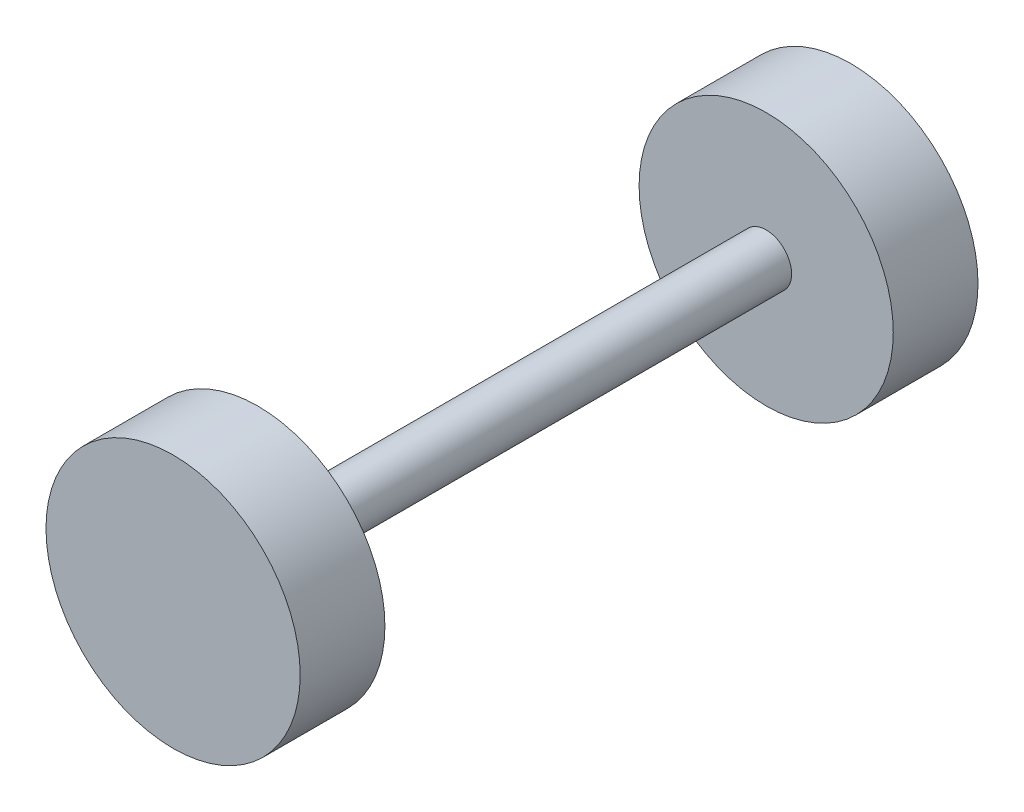
ISO-10303-21;
HEADER;
FILE_DESCRIPTION(('STEP AP214'),'2;1');
FILE_NAME('part.step','',(''),(''),'','','');
FILE_SCHEMA(('AUTOMOTIVE_DESIGN { 1 0 10303 214 1 1 1 1 }'));
ENDSEC;
DATA;
#1=APPLICATION_CONTEXT('core data for automotive mechanical design processes');
#2=APPLICATION_PROTOCOL_DEFINITION('international standard','automotive_design',2000,#1);
#3=PRODUCT_CONTEXT('',#1,'mechanical');
#4=PRODUCT('Part','Part','',(#3));
#5=PRODUCT_RELATED_PRODUCT_CATEGORY('part','',(#4));
#6=PRODUCT_DEFINITION_FORMATION('','',#4);
#7=PRODUCT_DEFINITION_CONTEXT('part definition',#1,'design');
#8=PRODUCT_DEFINITION('design','',#6,#7);
#9=PRODUCT_DEFINITION_SHAPE('','',#8);
#10=(LENGTH_UNIT() NAMED_UNIT(*) SI_UNIT(.MILLI.,.METRE.));
#11=(NAMED_UNIT(*) PLANE_ANGLE_UNIT() SI_UNIT($,.RADIAN.));
#12=(NAMED_UNIT(*) SI_UNIT($,.STERADIAN.) SOLID_ANGLE_UNIT());
#13=UNCERTAINTY_MEASURE_WITH_UNIT(LENGTH_MEASURE(1.E-05),#10,'distance_accuracy_value','');
#14=(GEOMETRIC_REPRESENTATION_CONTEXT(3) GLOBAL_UNCERTAINTY_ASSIGNED_CONTEXT((#13)) GLOBAL_UNIT_ASSIGNED_CONTEXT((#10,
#11,#12)) REPRESENTATION_CONTEXT('',''));
#15=CARTESIAN_POINT('',(0.,0.,0.));
#16=DIRECTION('',(0.,0.,1.));
#17=DIRECTION('',(1.,0.,0.));
#18=AXIS2_PLACEMENT_3D('',#15,#16,#17);
#19=CARTESIAN_POINT('',(0.,0.,5.));
#20=DIRECTION('',(0.,0.,-1.));
#21=DIRECTION('',(-1.,0.,0.));
#22=AXIS2_PLACEMENT_3D('',#19,#20,#21);
#23=CYLINDRICAL_SURFACE('',#22,7.5);
#24=CARTESIAN_POINT('',(0.,0.,5.));
#25=DIRECTION('',(0.,0.,1.));
#26=DIRECTION('',(1.,0.,0.));
#27=AXIS2_PLACEMENT_3D('',#24,#25,#26);
#28=CIRCLE('',#27,7.5);
#29=CARTESIAN_POINT('',(7.5,0.,5.));
#30=VERTEX_POINT('',#29);
#31=EDGE_CURVE('E40',#30,#30,#28,.T.);
#32=ORIENTED_EDGE('',*,*,#31,.F.);
#33=EDGE_LOOP('',(#32));
#34=FACE_BOUND('',#33,.T.);
#35=CARTESIAN_POINT('',(0.,0.,0.));
#36=DIRECTION('',(0.,0.,1.));
#37=DIRECTION('',(1.,0.,0.));
#38=AXIS2_PLACEMENT_3D('',#35,#36,#37);
#39=CIRCLE('',#38,7.5);
#40=CARTESIAN_POINT('',(7.5,0.,0.));
#41=VERTEX_POINT('',#40);
#42=EDGE_CURVE('E36',#41,#41,#39,.T.);
#43=ORIENTED_EDGE('',*,*,#42,.T.);
#44=EDGE_LOOP('',(#43));
#45=FACE_BOUND('',#44,.T.);
#46=ADVANCED_FACE('F33',(#34,#45),#23,.T.);
#47=CARTESIAN_POINT('',(0.,0.,5.));
#48=DIRECTION('',(0.,0.,1.));
#49=DIRECTION('',(1.,0.,0.));
#50=AXIS2_PLACEMENT_3D('',#47,#48,#49);
#51=PLANE('',#50);
#52=CARTESIAN_POINT('',(0.,0.,5.));
#53=DIRECTION('',(0.,0.,1.));
#54=DIRECTION('',(1.,0.,0.));
#55=AXIS2_PLACEMENT_3D('',#52,#53,#54);
#56=CIRCLE('',#55,1.5);
#57=CARTESIAN_POINT('',(1.5,0.,5.));
#58=VERTEX_POINT('',#57);
#59=EDGE_CURVE('E10',#58,#58,#56,.T.);
#60=ORIENTED_EDGE('',*,*,#59,.F.);
#61=EDGE_LOOP('',(#60));
#62=FACE_BOUND('',#61,.T.);
#63=ORIENTED_EDGE('',*,*,#31,.T.);
#64=EDGE_LOOP('',(#63));
#65=FACE_BOUND('',#64,.T.);
#66=ADVANCED_FACE('F74',(#62,#65),#51,.T.);
#67=CARTESIAN_POINT('',(0.,0.,0.));
#68=DIRECTION('',(0.,0.,1.));
#69=DIRECTION('',(1.,0.,0.));
#70=AXIS2_PLACEMENT_3D('',#67,#68,#69);
#71=PLANE('',#70);
#72=ORIENTED_EDGE('',*,*,#42,.F.);
#73=EDGE_LOOP('',(#72));
#74=FACE_BOUND('',#73,.T.);
#75=ADVANCED_FACE('F79',(#74),#71,.F.);
#76=CARTESIAN_POINT('',(0.,0.,35.));
#77=DIRECTION('',(0.,0.,-1.));
#78=DIRECTION('',(-1.,0.,0.));
#79=AXIS2_PLACEMENT_3D('',#76,#77,#78);
#80=CYLINDRICAL_SURFACE('',#79,1.5);
#81=CARTESIAN_POINT('',(0.,0.,35.));
#82=DIRECTION('',(0.,0.,1.));
#83=DIRECTION('',(1.,0.,0.));
#84=AXIS2_PLACEMENT_3D('',#81,#82,#83);
#85=CIRCLE('',#84,1.5);
#86=CARTESIAN_POINT('',(1.5,0.,35.));
#87=VERTEX_POINT('',#86);
#88=EDGE_CURVE('E46',#87,#87,#85,.T.);
#89=ORIENTED_EDGE('',*,*,#88,.F.);
#90=EDGE_LOOP('',(#89));
#91=FACE_BOUND('',#90,.T.);
#92=ORIENTED_EDGE('',*,*,#59,.T.);
#93=EDGE_LOOP('',(#92));
#94=FACE_BOUND('',#93,.T.);
#95=ADVANCED_FACE('F61',(#91,#94),#80,.T.);
#96=CARTESIAN_POINT('',(0.,0.,40.));
#97=DIRECTION('',(0.,0.,-1.));
#98=DIRECTION('',(-1.,0.,0.));
#99=AXIS2_PLACEMENT_3D('',#96,#97,#98);
#100=CYLINDRICAL_SURFACE('',#99,7.5);
#101=CARTESIAN_POINT('',(0.,0.,40.));
#102=DIRECTION('',(0.,0.,1.));
#103=DIRECTION('',(1.,0.,0.));
#104=AXIS2_PLACEMENT_3D('',#101,#102,#103);
#105=CIRCLE('',#104,7.5);
#106=CARTESIAN_POINT('',(7.5,0.,40.));
#107=VERTEX_POINT('',#106);
#108=EDGE_CURVE('E49',#107,#107,#105,.T.);
#109=ORIENTED_EDGE('',*,*,#108,.F.);
#110=EDGE_LOOP('',(#109));
#111=FACE_BOUND('',#110,.T.);
#112=CARTESIAN_POINT('',(0.,0.,35.));
#113=DIRECTION('',(0.,0.,1.));
#114=DIRECTION('',(1.,0.,0.));
#115=AXIS2_PLACEMENT_3D('',#112,#113,#114);
#116=CIRCLE('',#115,7.5);
#117=CARTESIAN_POINT('',(7.5,0.,35.));
#118=VERTEX_POINT('',#117);
#119=EDGE_CURVE('E50',#118,#118,#116,.T.);
#120=ORIENTED_EDGE('',*,*,#119,.T.);
#121=EDGE_LOOP('',(#120));
#122=FACE_BOUND('',#121,.T.);
#123=ADVANCED_FACE('F58',(#111,#122),#100,.T.);
#124=CARTESIAN_POINT('',(0.,0.,40.));
#125=DIRECTION('',(0.,0.,1.));
#126=DIRECTION('',(1.,0.,0.));
#127=AXIS2_PLACEMENT_3D('',#124,#125,#126);
#128=PLANE('',#127);
#129=ORIENTED_EDGE('',*,*,#108,.T.);
#130=EDGE_LOOP('',(#129));
#131=FACE_BOUND('',#130,.T.);
#132=ADVANCED_FACE('F56',(#131),#128,.T.);
#133=CARTESIAN_POINT('',(0.,0.,35.));
#134=DIRECTION('',(0.,0.,1.));
#135=DIRECTION('',(1.,0.,0.));
#136=AXIS2_PLACEMENT_3D('',#133,#134,#135);
#137=PLANE('',#136);
#138=ORIENTED_EDGE('',*,*,#88,.T.);
#139=EDGE_LOOP('',(#138));
#140=FACE_BOUND('',#139,.T.);
#141=ORIENTED_EDGE('',*,*,#119,.F.);
#142=EDGE_LOOP('',(#141));
#143=FACE_BOUND('',#142,.T.);
#144=ADVANCED_FACE('F65',(#140,#143),#137,.F.);
#145=CLOSED_SHELL('',(#46,#66,#75,#95,#123,#132,#144));
#146=MANIFOLD_SOLID_BREP('B2',#145);
#147=ADVANCED_BREP_SHAPE_REPRESENTATION('',(#18,#146),#14);
#148=SHAPE_DEFINITION_REPRESENTATION(#9,#147);
ENDSEC;
END-ISO-10303-21;
